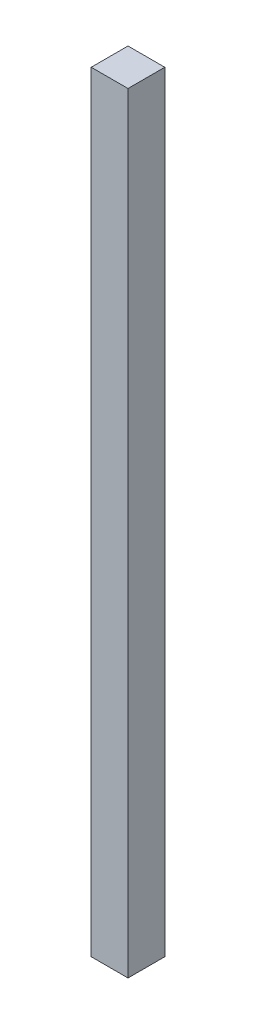
ISO-10303-21;
HEADER;
FILE_DESCRIPTION(('STEP AP214'),'2;1');
FILE_NAME('part.step','',(''),(''),'','','');
FILE_SCHEMA(('AUTOMOTIVE_DESIGN { 1 0 10303 214 1 1 1 1 }'));
ENDSEC;
DATA;
#1=APPLICATION_CONTEXT('core data for automotive mechanical design processes');
#2=APPLICATION_PROTOCOL_DEFINITION('international standard','automotive_design',2000,#1);
#3=PRODUCT_CONTEXT('',#1,'mechanical');
#4=PRODUCT('Part','Part','',(#3));
#5=PRODUCT_RELATED_PRODUCT_CATEGORY('part','',(#4));
#6=PRODUCT_DEFINITION_FORMATION('','',#4);
#7=PRODUCT_DEFINITION_CONTEXT('part definition',#1,'design');
#8=PRODUCT_DEFINITION('design','',#6,#7);
#9=PRODUCT_DEFINITION_SHAPE('','',#8);
#10=(LENGTH_UNIT() NAMED_UNIT(*) SI_UNIT(.MILLI.,.METRE.));
#11=(NAMED_UNIT(*) PLANE_ANGLE_UNIT() SI_UNIT($,.RADIAN.));
#12=(NAMED_UNIT(*) SI_UNIT($,.STERADIAN.) SOLID_ANGLE_UNIT());
#13=UNCERTAINTY_MEASURE_WITH_UNIT(LENGTH_MEASURE(1.E-05),#10,'distance_accuracy_value','');
#14=(GEOMETRIC_REPRESENTATION_CONTEXT(3) GLOBAL_UNCERTAINTY_ASSIGNED_CONTEXT((#13)) GLOBAL_UNIT_ASSIGNED_CONTEXT((#10,
#11,#12)) REPRESENTATION_CONTEXT('',''));
#15=CARTESIAN_POINT('',(0.,0.,0.));
#16=DIRECTION('',(0.,0.,1.));
#17=DIRECTION('',(1.,0.,0.));
#18=AXIS2_PLACEMENT_3D('',#15,#16,#17);
#19=CARTESIAN_POINT('',(44.45,930.671875,44.45));
#20=DIRECTION('',(-1.,0.,0.));
#21=DIRECTION('',(0.,0.,1.));
#22=AXIS2_PLACEMENT_3D('',#19,#20,#21);
#23=PLANE('',#22);
#24=DIRECTION('',(0.,0.,-1.));
#25=VECTOR('',#24,1.);
#26=CARTESIAN_POINT('',(44.45,-930.671875,44.45));
#27=LINE('',#26,#25);
#28=CARTESIAN_POINT('',(44.45,-930.671875,44.45));
#29=VERTEX_POINT('',#28);
#30=CARTESIAN_POINT('',(44.45,-930.671875,-44.45));
#31=VERTEX_POINT('',#30);
#32=EDGE_CURVE('E95',#29,#31,#27,.T.);
#33=ORIENTED_EDGE('',*,*,#32,.T.);
#34=DIRECTION('',(0.,-1.,0.));
#35=VECTOR('',#34,1.);
#36=CARTESIAN_POINT('',(44.45,930.671875,-44.45));
#37=LINE('',#36,#35);
#38=CARTESIAN_POINT('',(44.45,930.671875,-44.45));
#39=VERTEX_POINT('',#38);
#40=EDGE_CURVE('E11',#39,#31,#37,.T.);
#41=ORIENTED_EDGE('',*,*,#40,.F.);
#42=DIRECTION('',(0.,0.,-1.));
#43=VECTOR('',#42,1.);
#44=CARTESIAN_POINT('',(44.45,930.671875,44.45));
#45=LINE('',#44,#43);
#46=CARTESIAN_POINT('',(44.45,930.671875,44.45));
#47=VERTEX_POINT('',#46);
#48=EDGE_CURVE('E83',#47,#39,#45,.T.);
#49=ORIENTED_EDGE('',*,*,#48,.F.);
#50=DIRECTION('',(0.,-1.,0.));
#51=VECTOR('',#50,1.);
#52=CARTESIAN_POINT('',(44.45,930.671875,44.45));
#53=LINE('',#52,#51);
#54=EDGE_CURVE('E91',#47,#29,#53,.T.);
#55=ORIENTED_EDGE('',*,*,#54,.T.);
#56=EDGE_LOOP('',(#33,#41,#49,#55));
#57=FACE_BOUND('',#56,.T.);
#58=ADVANCED_FACE('F32',(#57),#23,.F.);
#59=CARTESIAN_POINT('',(-44.45,930.671875,-44.45));
#60=DIRECTION('',(0.,0.,1.));
#61=DIRECTION('',(1.,0.,0.));
#62=AXIS2_PLACEMENT_3D('',#59,#60,#61);
#63=PLANE('',#62);
#64=DIRECTION('',(-1.,0.,0.));
#65=VECTOR('',#64,1.);
#66=CARTESIAN_POINT('',(-44.45,-930.671875,-44.45));
#67=LINE('',#66,#65);
#68=CARTESIAN_POINT('',(-44.45,-930.671875,-44.45));
#69=VERTEX_POINT('',#68);
#70=EDGE_CURVE('E87',#31,#69,#67,.T.);
#71=ORIENTED_EDGE('',*,*,#70,.T.);
#72=DIRECTION('',(0.,-1.,0.));
#73=VECTOR('',#72,1.);
#74=CARTESIAN_POINT('',(-44.45,930.671875,-44.45));
#75=LINE('',#74,#73);
#76=CARTESIAN_POINT('',(-44.45,930.671875,-44.45));
#77=VERTEX_POINT('',#76);
#78=EDGE_CURVE('E40',#77,#69,#75,.T.);
#79=ORIENTED_EDGE('',*,*,#78,.F.);
#80=DIRECTION('',(-1.,0.,0.));
#81=VECTOR('',#80,1.);
#82=CARTESIAN_POINT('',(-44.45,930.671875,-44.45));
#83=LINE('',#82,#81);
#84=EDGE_CURVE('E78',#39,#77,#83,.T.);
#85=ORIENTED_EDGE('',*,*,#84,.F.);
#86=ORIENTED_EDGE('',*,*,#40,.T.);
#87=EDGE_LOOP('',(#71,#79,#85,#86));
#88=FACE_BOUND('',#87,.T.);
#89=ADVANCED_FACE('F86',(#88),#63,.F.);
#90=CARTESIAN_POINT('',(-44.45,930.671875,44.45));
#91=DIRECTION('',(1.,0.,0.));
#92=DIRECTION('',(0.,0.,-1.));
#93=AXIS2_PLACEMENT_3D('',#90,#91,#92);
#94=PLANE('',#93);
#95=DIRECTION('',(0.,0.,1.));
#96=VECTOR('',#95,1.);
#97=CARTESIAN_POINT('',(-44.45,-930.671875,44.45));
#98=LINE('',#97,#96);
#99=CARTESIAN_POINT('',(-44.45,-930.671875,44.45));
#100=VERTEX_POINT('',#99);
#101=EDGE_CURVE('E65',#69,#100,#98,.T.);
#102=ORIENTED_EDGE('',*,*,#101,.T.);
#103=DIRECTION('',(0.,-1.,0.));
#104=VECTOR('',#103,1.);
#105=CARTESIAN_POINT('',(-44.45,930.671875,44.45));
#106=LINE('',#105,#104);
#107=CARTESIAN_POINT('',(-44.45,930.671875,44.45));
#108=VERTEX_POINT('',#107);
#109=EDGE_CURVE('E88',#108,#100,#106,.T.);
#110=ORIENTED_EDGE('',*,*,#109,.F.);
#111=DIRECTION('',(0.,0.,1.));
#112=VECTOR('',#111,1.);
#113=CARTESIAN_POINT('',(-44.45,930.671875,44.45));
#114=LINE('',#113,#112);
#115=EDGE_CURVE('E81',#77,#108,#114,.T.);
#116=ORIENTED_EDGE('',*,*,#115,.F.);
#117=ORIENTED_EDGE('',*,*,#78,.T.);
#118=EDGE_LOOP('',(#102,#110,#116,#117));
#119=FACE_BOUND('',#118,.T.);
#120=ADVANCED_FACE('F89',(#119),#94,.F.);
#121=CARTESIAN_POINT('',(-44.45,930.671875,44.45));
#122=DIRECTION('',(0.,0.,-1.));
#123=DIRECTION('',(-1.,0.,0.));
#124=AXIS2_PLACEMENT_3D('',#121,#122,#123);
#125=PLANE('',#124);
#126=DIRECTION('',(1.,0.,0.));
#127=VECTOR('',#126,1.);
#128=CARTESIAN_POINT('',(-44.45,-930.671875,44.45));
#129=LINE('',#128,#127);
#130=EDGE_CURVE('E71',#100,#29,#129,.T.);
#131=ORIENTED_EDGE('',*,*,#130,.T.);
#132=ORIENTED_EDGE('',*,*,#54,.F.);
#133=DIRECTION('',(1.,0.,0.));
#134=VECTOR('',#133,1.);
#135=CARTESIAN_POINT('',(-44.45,930.671875,44.45));
#136=LINE('',#135,#134);
#137=EDGE_CURVE('E48',#108,#47,#136,.T.);
#138=ORIENTED_EDGE('',*,*,#137,.F.);
#139=ORIENTED_EDGE('',*,*,#109,.T.);
#140=EDGE_LOOP('',(#131,#132,#138,#139));
#141=FACE_BOUND('',#140,.T.);
#142=ADVANCED_FACE('F102',(#141),#125,.F.);
#143=CARTESIAN_POINT('',(0.,930.671875,0.));
#144=DIRECTION('',(0.,-1.,0.));
#145=DIRECTION('',(0.,0.,-1.));
#146=AXIS2_PLACEMENT_3D('',#143,#144,#145);
#147=PLANE('',#146);
#148=ORIENTED_EDGE('',*,*,#48,.T.);
#149=ORIENTED_EDGE('',*,*,#84,.T.);
#150=ORIENTED_EDGE('',*,*,#115,.T.);
#151=ORIENTED_EDGE('',*,*,#137,.T.);
#152=EDGE_LOOP('',(#148,#149,#150,#151));
#153=FACE_BOUND('',#152,.T.);
#154=ADVANCED_FACE('F79',(#153),#147,.F.);
#155=CARTESIAN_POINT('',(0.,-930.671875,0.));
#156=DIRECTION('',(0.,-1.,0.));
#157=DIRECTION('',(0.,0.,-1.));
#158=AXIS2_PLACEMENT_3D('',#155,#156,#157);
#159=PLANE('',#158);
#160=ORIENTED_EDGE('',*,*,#32,.F.);
#161=ORIENTED_EDGE('',*,*,#130,.F.);
#162=ORIENTED_EDGE('',*,*,#101,.F.);
#163=ORIENTED_EDGE('',*,*,#70,.F.);
#164=EDGE_LOOP('',(#160,#161,#162,#163));
#165=FACE_BOUND('',#164,.T.);
#166=ADVANCED_FACE('F105',(#165),#159,.T.);
#167=CLOSED_SHELL('',(#58,#89,#120,#142,#154,#166));
#168=MANIFOLD_SOLID_BREP('B2',#167);
#169=ADVANCED_BREP_SHAPE_REPRESENTATION('',(#18,#168),#14);
#170=SHAPE_DEFINITION_REPRESENTATION(#9,#169);
ENDSEC;
END-ISO-10303-21;
